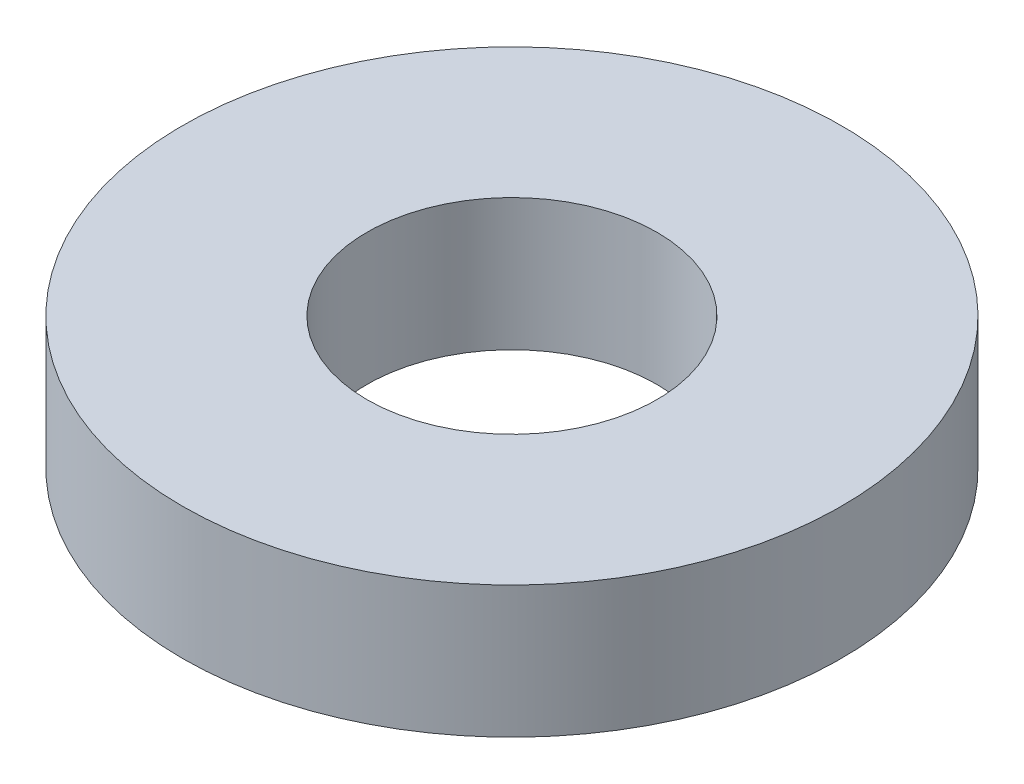
ISO-10303-21;
HEADER;
FILE_DESCRIPTION(('STEP AP214'),'2;1');
FILE_NAME('part.step','',(''),(''),'','','');
FILE_SCHEMA(('AUTOMOTIVE_DESIGN { 1 0 10303 214 1 1 1 1 }'));
ENDSEC;
DATA;
#1=APPLICATION_CONTEXT('core data for automotive mechanical design processes');
#2=APPLICATION_PROTOCOL_DEFINITION('international standard','automotive_design',2000,#1);
#3=PRODUCT_CONTEXT('',#1,'mechanical');
#4=PRODUCT('Part','Part','',(#3));
#5=PRODUCT_RELATED_PRODUCT_CATEGORY('part','',(#4));
#6=PRODUCT_DEFINITION_FORMATION('','',#4);
#7=PRODUCT_DEFINITION_CONTEXT('part definition',#1,'design');
#8=PRODUCT_DEFINITION('design','',#6,#7);
#9=PRODUCT_DEFINITION_SHAPE('','',#8);
#10=(LENGTH_UNIT() NAMED_UNIT(*) SI_UNIT(.MILLI.,.METRE.));
#11=(NAMED_UNIT(*) PLANE_ANGLE_UNIT() SI_UNIT($,.RADIAN.));
#12=(NAMED_UNIT(*) SI_UNIT($,.STERADIAN.) SOLID_ANGLE_UNIT());
#13=UNCERTAINTY_MEASURE_WITH_UNIT(LENGTH_MEASURE(1.E-05),#10,'distance_accuracy_value','');
#14=(GEOMETRIC_REPRESENTATION_CONTEXT(3) GLOBAL_UNCERTAINTY_ASSIGNED_CONTEXT((#13)) GLOBAL_UNIT_ASSIGNED_CONTEXT((#10,
#11,#12)) REPRESENTATION_CONTEXT('',''));
#15=CARTESIAN_POINT('',(0.,0.,0.));
#16=DIRECTION('',(0.,0.,1.));
#17=DIRECTION('',(1.,0.,0.));
#18=AXIS2_PLACEMENT_3D('',#15,#16,#17);
#19=CARTESIAN_POINT('',(0.,1.,0.));
#20=DIRECTION('',(0.,1.,0.));
#21=DIRECTION('',(0.,0.,1.));
#22=AXIS2_PLACEMENT_3D('',#19,#20,#21);
#23=PLANE('',#22);
#24=CARTESIAN_POINT('',(0.,1.,0.));
#25=DIRECTION('',(0.,1.,0.));
#26=DIRECTION('',(0.,0.,1.));
#27=AXIS2_PLACEMENT_3D('',#24,#25,#26);
#28=CIRCLE('',#27,2.5);
#29=CARTESIAN_POINT('',(0.,1.,2.5));
#30=VERTEX_POINT('',#29);
#31=EDGE_CURVE('E10',#30,#30,#28,.T.);
#32=ORIENTED_EDGE('',*,*,#31,.T.);
#33=EDGE_LOOP('',(#32));
#34=FACE_BOUND('',#33,.T.);
#35=CARTESIAN_POINT('',(0.,1.,0.));
#36=DIRECTION('',(0.,1.,0.));
#37=DIRECTION('',(0.,0.,1.));
#38=AXIS2_PLACEMENT_3D('',#35,#36,#37);
#39=CIRCLE('',#38,1.1);
#40=CARTESIAN_POINT('',(0.,1.,1.1));
#41=VERTEX_POINT('',#40);
#42=EDGE_CURVE('E46',#41,#41,#39,.T.);
#43=ORIENTED_EDGE('',*,*,#42,.F.);
#44=EDGE_LOOP('',(#43));
#45=FACE_BOUND('',#44,.T.);
#46=ADVANCED_FACE('F35',(#34,#45),#23,.T.);
#47=CARTESIAN_POINT('',(0.,0.,0.));
#48=DIRECTION('',(0.,1.,0.));
#49=DIRECTION('',(0.,0.,1.));
#50=AXIS2_PLACEMENT_3D('',#47,#48,#49);
#51=PLANE('',#50);
#52=CARTESIAN_POINT('',(0.,0.,0.));
#53=DIRECTION('',(0.,1.,0.));
#54=DIRECTION('',(0.,0.,1.));
#55=AXIS2_PLACEMENT_3D('',#52,#53,#54);
#56=CIRCLE('',#55,2.5);
#57=CARTESIAN_POINT('',(0.,0.,2.5));
#58=VERTEX_POINT('',#57);
#59=EDGE_CURVE('E39',#58,#58,#56,.T.);
#60=ORIENTED_EDGE('',*,*,#59,.F.);
#61=EDGE_LOOP('',(#60));
#62=FACE_BOUND('',#61,.T.);
#63=CARTESIAN_POINT('',(0.,0.,0.));
#64=DIRECTION('',(0.,1.,0.));
#65=DIRECTION('',(0.,0.,1.));
#66=AXIS2_PLACEMENT_3D('',#63,#64,#65);
#67=CIRCLE('',#66,1.1);
#68=CARTESIAN_POINT('',(0.,0.,1.1));
#69=VERTEX_POINT('',#68);
#70=EDGE_CURVE('E48',#69,#69,#67,.T.);
#71=ORIENTED_EDGE('',*,*,#70,.T.);
#72=EDGE_LOOP('',(#71));
#73=FACE_BOUND('',#72,.T.);
#74=ADVANCED_FACE('F58',(#62,#73),#51,.F.);
#75=CARTESIAN_POINT('',(0.,1.,0.));
#76=DIRECTION('',(0.,-1.,0.));
#77=DIRECTION('',(0.,0.,-1.));
#78=AXIS2_PLACEMENT_3D('',#75,#76,#77);
#79=CYLINDRICAL_SURFACE('',#78,2.5);
#80=ORIENTED_EDGE('',*,*,#31,.F.);
#81=EDGE_LOOP('',(#80));
#82=FACE_BOUND('',#81,.T.);
#83=ORIENTED_EDGE('',*,*,#59,.T.);
#84=EDGE_LOOP('',(#83));
#85=FACE_BOUND('',#84,.T.);
#86=ADVANCED_FACE('F37',(#82,#85),#79,.T.);
#87=CARTESIAN_POINT('',(0.,1.,0.));
#88=DIRECTION('',(0.,-1.,0.));
#89=DIRECTION('',(0.,0.,-1.));
#90=AXIS2_PLACEMENT_3D('',#87,#88,#89);
#91=CYLINDRICAL_SURFACE('',#90,1.1);
#92=ORIENTED_EDGE('',*,*,#42,.T.);
#93=EDGE_LOOP('',(#92));
#94=FACE_BOUND('',#93,.T.);
#95=ORIENTED_EDGE('',*,*,#70,.F.);
#96=EDGE_LOOP('',(#95));
#97=FACE_BOUND('',#96,.T.);
#98=ADVANCED_FACE('F54',(#94,#97),#91,.F.);
#99=CLOSED_SHELL('',(#46,#74,#86,#98));
#100=MANIFOLD_SOLID_BREP('B2',#99);
#101=ADVANCED_BREP_SHAPE_REPRESENTATION('',(#18,#100),#14);
#102=SHAPE_DEFINITION_REPRESENTATION(#9,#101);
ENDSEC;
END-ISO-10303-21;
